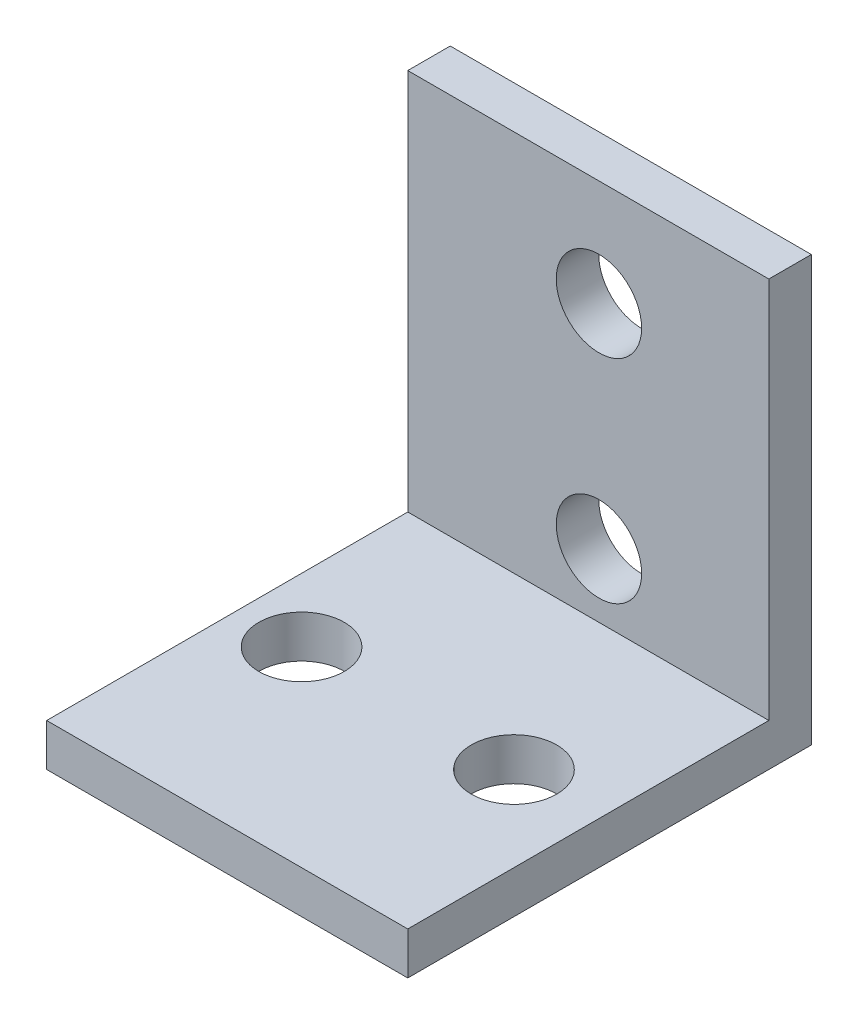
ISO-10303-21;
HEADER;
FILE_DESCRIPTION(('STEP AP214'),'2;1');
FILE_NAME('part.step','',(''),(''),'','','');
FILE_SCHEMA(('AUTOMOTIVE_DESIGN { 1 0 10303 214 1 1 1 1 }'));
ENDSEC;
DATA;
#1=APPLICATION_CONTEXT('core data for automotive mechanical design processes');
#2=APPLICATION_PROTOCOL_DEFINITION('international standard','automotive_design',2000,#1);
#3=PRODUCT_CONTEXT('',#1,'mechanical');
#4=PRODUCT('Part','Part','',(#3));
#5=PRODUCT_RELATED_PRODUCT_CATEGORY('part','',(#4));
#6=PRODUCT_DEFINITION_FORMATION('','',#4);
#7=PRODUCT_DEFINITION_CONTEXT('part definition',#1,'design');
#8=PRODUCT_DEFINITION('design','',#6,#7);
#9=PRODUCT_DEFINITION_SHAPE('','',#8);
#10=(LENGTH_UNIT() NAMED_UNIT(*) SI_UNIT(.MILLI.,.METRE.));
#11=(NAMED_UNIT(*) PLANE_ANGLE_UNIT() SI_UNIT($,.RADIAN.));
#12=(NAMED_UNIT(*) SI_UNIT($,.STERADIAN.) SOLID_ANGLE_UNIT());
#13=UNCERTAINTY_MEASURE_WITH_UNIT(LENGTH_MEASURE(1.E-05),#10,'distance_accuracy_value','');
#14=(GEOMETRIC_REPRESENTATION_CONTEXT(3) GLOBAL_UNCERTAINTY_ASSIGNED_CONTEXT((#13)) GLOBAL_UNIT_ASSIGNED_CONTEXT((#10,
#11,#12)) REPRESENTATION_CONTEXT('',''));
#15=CARTESIAN_POINT('',(0.,0.,0.));
#16=DIRECTION('',(0.,0.,1.));
#17=DIRECTION('',(1.,0.,0.));
#18=AXIS2_PLACEMENT_3D('',#15,#16,#17);
#19=CARTESIAN_POINT('',(0.,0.,24.13));
#20=DIRECTION('',(1.,0.,0.));
#21=DIRECTION('',(0.,0.,-1.));
#22=AXIS2_PLACEMENT_3D('',#19,#20,#21);
#23=PLANE('',#22);
#24=DIRECTION('',(0.,0.,-1.));
#25=VECTOR('',#24,1.);
#26=CARTESIAN_POINT('',(0.,2.54,2.54));
#27=LINE('',#26,#25);
#28=CARTESIAN_POINT('',(0.,2.54,24.13));
#29=VERTEX_POINT('',#28);
#30=CARTESIAN_POINT('',(0.,2.54,2.54));
#31=VERTEX_POINT('',#30);
#32=EDGE_CURVE('E54',#29,#31,#27,.T.);
#33=ORIENTED_EDGE('',*,*,#32,.T.);
#34=DIRECTION('',(0.,1.,0.));
#35=VECTOR('',#34,1.);
#36=CARTESIAN_POINT('',(0.,25.4,2.54));
#37=LINE('',#36,#35);
#38=CARTESIAN_POINT('',(0.,25.4,2.54));
#39=VERTEX_POINT('',#38);
#40=EDGE_CURVE('E90',#31,#39,#37,.T.);
#41=ORIENTED_EDGE('',*,*,#40,.T.);
#42=DIRECTION('',(0.,0.,-1.));
#43=VECTOR('',#42,1.);
#44=CARTESIAN_POINT('',(0.,25.4,24.13));
#45=LINE('',#44,#43);
#46=CARTESIAN_POINT('',(0.,25.4,0.));
#47=VERTEX_POINT('',#46);
#48=EDGE_CURVE('E83',#39,#47,#45,.T.);
#49=ORIENTED_EDGE('',*,*,#48,.T.);
#50=DIRECTION('',(0.,-1.,0.));
#51=VECTOR('',#50,1.);
#52=CARTESIAN_POINT('',(0.,0.,0.));
#53=LINE('',#52,#51);
#54=CARTESIAN_POINT('',(0.,0.,0.));
#55=VERTEX_POINT('',#54);
#56=EDGE_CURVE('E87',#47,#55,#53,.T.);
#57=ORIENTED_EDGE('',*,*,#56,.T.);
#58=DIRECTION('',(0.,0.,-1.));
#59=VECTOR('',#58,1.);
#60=CARTESIAN_POINT('',(0.,0.,24.13));
#61=LINE('',#60,#59);
#62=CARTESIAN_POINT('',(0.,0.,24.13));
#63=VERTEX_POINT('',#62);
#64=EDGE_CURVE('E11',#63,#55,#61,.T.);
#65=ORIENTED_EDGE('',*,*,#64,.F.);
#66=DIRECTION('',(0.,-1.,0.));
#67=VECTOR('',#66,1.);
#68=CARTESIAN_POINT('',(0.,0.,24.13));
#69=LINE('',#68,#67);
#70=EDGE_CURVE('E105',#29,#63,#69,.T.);
#71=ORIENTED_EDGE('',*,*,#70,.F.);
#72=EDGE_LOOP('',(#33,#41,#49,#57,#65,#71));
#73=FACE_BOUND('',#72,.T.);
#74=ADVANCED_FACE('F39',(#73),#23,.F.);
#75=CARTESIAN_POINT('',(0.,0.,24.13));
#76=DIRECTION('',(0.,1.,0.));
#77=DIRECTION('',(0.,0.,1.));
#78=AXIS2_PLACEMENT_3D('',#75,#76,#77);
#79=PLANE('',#78);
#80=CARTESIAN_POINT('',(16.51,0.,12.7));
#81=DIRECTION('',(0.,1.,0.));
#82=DIRECTION('',(0.,0.,1.));
#83=AXIS2_PLACEMENT_3D('',#80,#81,#82);
#84=CIRCLE('',#83,2.5527);
#85=CARTESIAN_POINT('',(16.51,0.,15.2527));
#86=VERTEX_POINT('',#85);
#87=EDGE_CURVE('E161',#86,#86,#84,.T.);
#88=ORIENTED_EDGE('',*,*,#87,.T.);
#89=EDGE_LOOP('',(#88));
#90=FACE_BOUND('',#89,.T.);
#91=CARTESIAN_POINT('',(3.81,0.,12.7));
#92=DIRECTION('',(0.,1.,0.));
#93=DIRECTION('',(0.,0.,1.));
#94=AXIS2_PLACEMENT_3D('',#91,#92,#93);
#95=CIRCLE('',#94,2.5527);
#96=CARTESIAN_POINT('',(3.81,0.,15.2527));
#97=VERTEX_POINT('',#96);
#98=EDGE_CURVE('E176',#97,#97,#95,.T.);
#99=ORIENTED_EDGE('',*,*,#98,.T.);
#100=EDGE_LOOP('',(#99));
#101=FACE_BOUND('',#100,.T.);
#102=DIRECTION('',(1.,0.,0.));
#103=VECTOR('',#102,1.);
#104=CARTESIAN_POINT('',(0.,0.,0.));
#105=LINE('',#104,#103);
#106=CARTESIAN_POINT('',(21.59,0.,0.));
#107=VERTEX_POINT('',#106);
#108=EDGE_CURVE('E109',#55,#107,#105,.T.);
#109=ORIENTED_EDGE('',*,*,#108,.T.);
#110=DIRECTION('',(0.,0.,-1.));
#111=VECTOR('',#110,1.);
#112=CARTESIAN_POINT('',(21.59,0.,24.13));
#113=LINE('',#112,#111);
#114=CARTESIAN_POINT('',(21.59,0.,24.13));
#115=VERTEX_POINT('',#114);
#116=EDGE_CURVE('E47',#115,#107,#113,.T.);
#117=ORIENTED_EDGE('',*,*,#116,.F.);
#118=DIRECTION('',(1.,0.,0.));
#119=VECTOR('',#118,1.);
#120=CARTESIAN_POINT('',(0.,0.,24.13));
#121=LINE('',#120,#119);
#122=EDGE_CURVE('E63',#63,#115,#121,.T.);
#123=ORIENTED_EDGE('',*,*,#122,.F.);
#124=ORIENTED_EDGE('',*,*,#64,.T.);
#125=EDGE_LOOP('',(#109,#117,#123,#124));
#126=FACE_BOUND('',#125,.T.);
#127=ADVANCED_FACE('F132',(#90,#101,#126),#79,.F.);
#128=CARTESIAN_POINT('',(21.59,0.,24.13));
#129=DIRECTION('',(-1.,0.,0.));
#130=DIRECTION('',(0.,0.,1.));
#131=AXIS2_PLACEMENT_3D('',#128,#129,#130);
#132=PLANE('',#131);
#133=DIRECTION('',(0.,0.,-1.));
#134=VECTOR('',#133,1.);
#135=CARTESIAN_POINT('',(21.59,25.4,24.13));
#136=LINE('',#135,#134);
#137=CARTESIAN_POINT('',(21.59,25.4,2.54));
#138=VERTEX_POINT('',#137);
#139=CARTESIAN_POINT('',(21.59,25.4,0.));
#140=VERTEX_POINT('',#139);
#141=EDGE_CURVE('E94',#138,#140,#136,.T.);
#142=ORIENTED_EDGE('',*,*,#141,.F.);
#143=DIRECTION('',(0.,1.,0.));
#144=VECTOR('',#143,1.);
#145=CARTESIAN_POINT('',(21.59,25.4,2.54));
#146=LINE('',#145,#144);
#147=CARTESIAN_POINT('',(21.59,2.54,2.54));
#148=VERTEX_POINT('',#147);
#149=EDGE_CURVE('E147',#148,#138,#146,.T.);
#150=ORIENTED_EDGE('',*,*,#149,.F.);
#151=DIRECTION('',(0.,0.,-1.));
#152=VECTOR('',#151,1.);
#153=CARTESIAN_POINT('',(21.59,2.54,2.54));
#154=LINE('',#153,#152);
#155=CARTESIAN_POINT('',(21.59,2.54,24.13));
#156=VERTEX_POINT('',#155);
#157=EDGE_CURVE('E143',#156,#148,#154,.T.);
#158=ORIENTED_EDGE('',*,*,#157,.F.);
#159=DIRECTION('',(0.,1.,0.));
#160=VECTOR('',#159,1.);
#161=CARTESIAN_POINT('',(21.59,0.,24.13));
#162=LINE('',#161,#160);
#163=EDGE_CURVE('E95',#115,#156,#162,.T.);
#164=ORIENTED_EDGE('',*,*,#163,.F.);
#165=ORIENTED_EDGE('',*,*,#116,.T.);
#166=DIRECTION('',(0.,1.,0.));
#167=VECTOR('',#166,1.);
#168=CARTESIAN_POINT('',(21.59,0.,0.));
#169=LINE('',#168,#167);
#170=EDGE_CURVE('E106',#107,#140,#169,.T.);
#171=ORIENTED_EDGE('',*,*,#170,.T.);
#172=EDGE_LOOP('',(#142,#150,#158,#164,#165,#171));
#173=FACE_BOUND('',#172,.T.);
#174=ADVANCED_FACE('F129',(#173),#132,.F.);
#175=CARTESIAN_POINT('',(0.,25.4,24.13));
#176=DIRECTION('',(0.,-1.,0.));
#177=DIRECTION('',(0.,0.,-1.));
#178=AXIS2_PLACEMENT_3D('',#175,#176,#177);
#179=PLANE('',#178);
#180=ORIENTED_EDGE('',*,*,#48,.F.);
#181=DIRECTION('',(1.,0.,0.));
#182=VECTOR('',#181,1.);
#183=CARTESIAN_POINT('',(0.,25.4,2.54));
#184=LINE('',#183,#182);
#185=EDGE_CURVE('E138',#39,#138,#184,.T.);
#186=ORIENTED_EDGE('',*,*,#185,.T.);
#187=ORIENTED_EDGE('',*,*,#141,.T.);
#188=DIRECTION('',(-1.,0.,0.));
#189=VECTOR('',#188,1.);
#190=CARTESIAN_POINT('',(0.,25.4,0.));
#191=LINE('',#190,#189);
#192=EDGE_CURVE('E98',#140,#47,#191,.T.);
#193=ORIENTED_EDGE('',*,*,#192,.T.);
#194=EDGE_LOOP('',(#180,#186,#187,#193));
#195=FACE_BOUND('',#194,.T.);
#196=ADVANCED_FACE('F99',(#195),#179,.F.);
#197=CARTESIAN_POINT('',(0.,0.,24.13));
#198=DIRECTION('',(0.,0.,-1.));
#199=DIRECTION('',(-1.,0.,0.));
#200=AXIS2_PLACEMENT_3D('',#197,#198,#199);
#201=PLANE('',#200);
#202=ORIENTED_EDGE('',*,*,#163,.T.);
#203=DIRECTION('',(1.,0.,0.));
#204=VECTOR('',#203,1.);
#205=CARTESIAN_POINT('',(0.,2.54,24.13));
#206=LINE('',#205,#204);
#207=EDGE_CURVE('E117',#29,#156,#206,.T.);
#208=ORIENTED_EDGE('',*,*,#207,.F.);
#209=ORIENTED_EDGE('',*,*,#70,.T.);
#210=ORIENTED_EDGE('',*,*,#122,.T.);
#211=EDGE_LOOP('',(#202,#208,#209,#210));
#212=FACE_BOUND('',#211,.T.);
#213=ADVANCED_FACE('F220',(#212),#201,.F.);
#214=CARTESIAN_POINT('',(0.,0.,0.));
#215=DIRECTION('',(0.,0.,-1.));
#216=DIRECTION('',(-1.,0.,0.));
#217=AXIS2_PLACEMENT_3D('',#214,#215,#216);
#218=PLANE('',#217);
#219=CARTESIAN_POINT('',(11.43,19.05,0.));
#220=DIRECTION('',(0.,0.,1.));
#221=DIRECTION('',(1.,0.,0.));
#222=AXIS2_PLACEMENT_3D('',#219,#220,#221);
#223=CIRCLE('',#222,2.5527);
#224=CARTESIAN_POINT('',(13.9827,19.05,0.));
#225=VERTEX_POINT('',#224);
#226=EDGE_CURVE('E151',#225,#225,#223,.T.);
#227=ORIENTED_EDGE('',*,*,#226,.T.);
#228=EDGE_LOOP('',(#227));
#229=FACE_BOUND('',#228,.T.);
#230=CARTESIAN_POINT('',(11.43,6.35,0.));
#231=DIRECTION('',(0.,0.,1.));
#232=DIRECTION('',(1.,0.,0.));
#233=AXIS2_PLACEMENT_3D('',#230,#231,#232);
#234=CIRCLE('',#233,2.5527);
#235=CARTESIAN_POINT('',(13.9827,6.35,0.));
#236=VERTEX_POINT('',#235);
#237=EDGE_CURVE('E160',#236,#236,#234,.T.);
#238=ORIENTED_EDGE('',*,*,#237,.T.);
#239=EDGE_LOOP('',(#238));
#240=FACE_BOUND('',#239,.T.);
#241=ORIENTED_EDGE('',*,*,#56,.F.);
#242=ORIENTED_EDGE('',*,*,#192,.F.);
#243=ORIENTED_EDGE('',*,*,#170,.F.);
#244=ORIENTED_EDGE('',*,*,#108,.F.);
#245=EDGE_LOOP('',(#241,#242,#243,#244));
#246=FACE_BOUND('',#245,.T.);
#247=ADVANCED_FACE('F108',(#229,#240,#246),#218,.T.);
#248=CARTESIAN_POINT('',(0.,25.4,2.54));
#249=DIRECTION('',(0.,0.,-1.));
#250=DIRECTION('',(0.,1.,0.));
#251=AXIS2_PLACEMENT_3D('',#248,#249,#250);
#252=PLANE('',#251);
#253=CARTESIAN_POINT('',(11.43,19.05,2.54));
#254=DIRECTION('',(0.,0.,1.));
#255=DIRECTION('',(1.,0.,0.));
#256=AXIS2_PLACEMENT_3D('',#253,#254,#255);
#257=CIRCLE('',#256,2.5527);
#258=CARTESIAN_POINT('',(13.9827,19.05,2.54));
#259=VERTEX_POINT('',#258);
#260=EDGE_CURVE('E165',#259,#259,#257,.T.);
#261=ORIENTED_EDGE('',*,*,#260,.F.);
#262=EDGE_LOOP('',(#261));
#263=FACE_BOUND('',#262,.T.);
#264=CARTESIAN_POINT('',(11.43,6.35,2.54));
#265=DIRECTION('',(0.,0.,1.));
#266=DIRECTION('',(1.,0.,0.));
#267=AXIS2_PLACEMENT_3D('',#264,#265,#266);
#268=CIRCLE('',#267,2.5527);
#269=CARTESIAN_POINT('',(13.9827,6.35,2.54));
#270=VERTEX_POINT('',#269);
#271=EDGE_CURVE('E156',#270,#270,#268,.T.);
#272=ORIENTED_EDGE('',*,*,#271,.F.);
#273=EDGE_LOOP('',(#272));
#274=FACE_BOUND('',#273,.T.);
#275=ORIENTED_EDGE('',*,*,#149,.T.);
#276=ORIENTED_EDGE('',*,*,#185,.F.);
#277=ORIENTED_EDGE('',*,*,#40,.F.);
#278=DIRECTION('',(1.,0.,0.));
#279=VECTOR('',#278,1.);
#280=CARTESIAN_POINT('',(0.,2.54,2.54));
#281=LINE('',#280,#279);
#282=EDGE_CURVE('E111',#31,#148,#281,.T.);
#283=ORIENTED_EDGE('',*,*,#282,.T.);
#284=EDGE_LOOP('',(#275,#276,#277,#283));
#285=FACE_BOUND('',#284,.T.);
#286=ADVANCED_FACE('F201',(#263,#274,#285),#252,.F.);
#287=CARTESIAN_POINT('',(0.,2.54,2.54));
#288=DIRECTION('',(0.,-1.,0.));
#289=DIRECTION('',(0.,0.,-1.));
#290=AXIS2_PLACEMENT_3D('',#287,#288,#289);
#291=PLANE('',#290);
#292=CARTESIAN_POINT('',(16.51,2.54,12.7));
#293=DIRECTION('',(0.,1.,0.));
#294=DIRECTION('',(0.,0.,1.));
#295=AXIS2_PLACEMENT_3D('',#292,#293,#294);
#296=CIRCLE('',#295,2.5527);
#297=CARTESIAN_POINT('',(16.51,2.54,15.2527));
#298=VERTEX_POINT('',#297);
#299=EDGE_CURVE('E180',#298,#298,#296,.T.);
#300=ORIENTED_EDGE('',*,*,#299,.F.);
#301=EDGE_LOOP('',(#300));
#302=FACE_BOUND('',#301,.T.);
#303=CARTESIAN_POINT('',(3.81,2.54,12.7));
#304=DIRECTION('',(0.,1.,0.));
#305=DIRECTION('',(0.,0.,1.));
#306=AXIS2_PLACEMENT_3D('',#303,#304,#305);
#307=CIRCLE('',#306,2.5527);
#308=CARTESIAN_POINT('',(3.81,2.54,15.2527));
#309=VERTEX_POINT('',#308);
#310=EDGE_CURVE('E172',#309,#309,#307,.T.);
#311=ORIENTED_EDGE('',*,*,#310,.F.);
#312=EDGE_LOOP('',(#311));
#313=FACE_BOUND('',#312,.T.);
#314=ORIENTED_EDGE('',*,*,#157,.T.);
#315=ORIENTED_EDGE('',*,*,#282,.F.);
#316=ORIENTED_EDGE('',*,*,#32,.F.);
#317=ORIENTED_EDGE('',*,*,#207,.T.);
#318=EDGE_LOOP('',(#314,#315,#316,#317));
#319=FACE_BOUND('',#318,.T.);
#320=ADVANCED_FACE('F197',(#302,#313,#319),#291,.F.);
#321=CARTESIAN_POINT('',(11.43,6.35,0.));
#322=DIRECTION('',(0.,0.,1.));
#323=DIRECTION('',(1.,0.,0.));
#324=AXIS2_PLACEMENT_3D('',#321,#322,#323);
#325=CYLINDRICAL_SURFACE('',#324,2.5527);
#326=CARTESIAN_POINT('',(13.9827,6.35,0.));
#327=CARTESIAN_POINT('',(13.9827,6.35,0.0264583333333333));
#328=CARTESIAN_POINT('',(13.9827,6.35,0.0529166666666666));
#329=CARTESIAN_POINT('',(13.9827,6.35,0.105833333333333));
#330=CARTESIAN_POINT('',(13.9827,6.35,0.132291666666667));
#331=CARTESIAN_POINT('',(13.9827,6.35,0.185208333333333));
#332=CARTESIAN_POINT('',(13.9827,6.35,0.211666666666666));
#333=CARTESIAN_POINT('',(13.9827,6.35,0.264583333333333));
#334=CARTESIAN_POINT('',(13.9827,6.35,0.291041666666666));
#335=CARTESIAN_POINT('',(13.9827,6.35,0.343958333333333));
#336=CARTESIAN_POINT('',(13.9827,6.35,0.370416666666666));
#337=CARTESIAN_POINT('',(13.9827,6.35,0.423333333333333));
#338=CARTESIAN_POINT('',(13.9827,6.35,0.449791666666666));
#339=CARTESIAN_POINT('',(13.9827,6.35,0.502708333333333));
#340=CARTESIAN_POINT('',(13.9827,6.35,0.529166666666666));
#341=CARTESIAN_POINT('',(13.9827,6.35,0.582083333333333));
#342=CARTESIAN_POINT('',(13.9827,6.35,0.608541666666666));
#343=CARTESIAN_POINT('',(13.9827,6.35,0.661458333333333));
#344=CARTESIAN_POINT('',(13.9827,6.35,0.687916666666666));
#345=CARTESIAN_POINT('',(13.9827,6.35,0.740833333333333));
#346=CARTESIAN_POINT('',(13.9827,6.35,0.767291666666666));
#347=CARTESIAN_POINT('',(13.9827,6.35,0.820208333333333));
#348=CARTESIAN_POINT('',(13.9827,6.35,0.846666666666666));
#349=CARTESIAN_POINT('',(13.9827,6.35,0.899583333333333));
#350=CARTESIAN_POINT('',(13.9827,6.35,0.926041666666666));
#351=CARTESIAN_POINT('',(13.9827,6.35,0.978958333333332));
#352=CARTESIAN_POINT('',(13.9827,6.35,1.00541666666667));
#353=CARTESIAN_POINT('',(13.9827,6.35,1.05833333333333));
#354=CARTESIAN_POINT('',(13.9827,6.35,1.08479166666667));
#355=CARTESIAN_POINT('',(13.9827,6.35,1.13770833333333));
#356=CARTESIAN_POINT('',(13.9827,6.35,1.16416666666667));
#357=CARTESIAN_POINT('',(13.9827,6.35,1.21708333333333));
#358=CARTESIAN_POINT('',(13.9827,6.35,1.24354166666667));
#359=CARTESIAN_POINT('',(13.9827,6.35,1.29645833333333));
#360=CARTESIAN_POINT('',(13.9827,6.35,1.32291666666667));
#361=CARTESIAN_POINT('',(13.9827,6.35,1.37583333333333));
#362=CARTESIAN_POINT('',(13.9827,6.35,1.40229166666667));
#363=CARTESIAN_POINT('',(13.9827,6.35,1.45520833333333));
#364=CARTESIAN_POINT('',(13.9827,6.35,1.48166666666667));
#365=CARTESIAN_POINT('',(13.9827,6.35,1.53458333333333));
#366=CARTESIAN_POINT('',(13.9827,6.35,1.56104166666667));
#367=CARTESIAN_POINT('',(13.9827,6.35,1.61395833333333));
#368=CARTESIAN_POINT('',(13.9827,6.35,1.64041666666667));
#369=CARTESIAN_POINT('',(13.9827,6.35,1.69333333333333));
#370=CARTESIAN_POINT('',(13.9827,6.35,1.71979166666667));
#371=CARTESIAN_POINT('',(13.9827,6.35,1.77270833333333));
#372=CARTESIAN_POINT('',(13.9827,6.35,1.79916666666667));
#373=CARTESIAN_POINT('',(13.9827,6.35,1.85208333333333));
#374=CARTESIAN_POINT('',(13.9827,6.35,1.87854166666666));
#375=CARTESIAN_POINT('',(13.9827,6.35,1.93145833333333));
#376=CARTESIAN_POINT('',(13.9827,6.35,1.95791666666666));
#377=CARTESIAN_POINT('',(13.9827,6.35,2.01083333333333));
#378=CARTESIAN_POINT('',(13.9827,6.35,2.03729166666666));
#379=CARTESIAN_POINT('',(13.9827,6.35,2.09020833333333));
#380=CARTESIAN_POINT('',(13.9827,6.35,2.11666666666666));
#381=CARTESIAN_POINT('',(13.9827,6.35,2.16958333333333));
#382=CARTESIAN_POINT('',(13.9827,6.35,2.19604166666666));
#383=CARTESIAN_POINT('',(13.9827,6.35,2.24895833333333));
#384=CARTESIAN_POINT('',(13.9827,6.35,2.27541666666666));
#385=CARTESIAN_POINT('',(13.9827,6.35,2.32833333333333));
#386=CARTESIAN_POINT('',(13.9827,6.35,2.35479166666666));
#387=CARTESIAN_POINT('',(13.9827,6.35,2.40770833333333));
#388=CARTESIAN_POINT('',(13.9827,6.35,2.43416666666666));
#389=CARTESIAN_POINT('',(13.9827,6.35,2.48708333333333));
#390=CARTESIAN_POINT('',(13.9827,6.35,2.51354166666666));
#391=CARTESIAN_POINT('',(13.9827,6.35,2.54));
#392=B_SPLINE_CURVE_WITH_KNOTS('',3,(#326,#327,#328,#329,#330,#331,#332,#333,#334,#335,#336,
#337,#338,#339,#340,#341,#342,#343,#344,#345,#346,#347,#348,#349,#350,#351,#352,#353,#354,#355,
#356,#357,#358,#359,#360,#361,#362,#363,#364,#365,#366,#367,#368,#369,#370,#371,#372,#373,#374,
#375,#376,#377,#378,#379,#380,#381,#382,#383,#384,#385,#386,#387,#388,#389,#390,#391),
.UNSPECIFIED.,.F.,.F.,(4,2,2,2,2,2,2,2,2,2,2,2,2,2,2,2,2,2,2,2,2,2,2,2,2,2,2,2,2,2,2,2,4),(0.,
0.0793749999999999,0.15875,0.238125,0.3175,0.396875,0.47625,0.555624999999999,0.634999999999999,
0.714374999999999,0.793749999999999,0.873124999999999,0.952499999999999,1.031875,1.11125,
1.190625,1.27,1.349375,1.42875,1.508125,1.5875,1.666875,1.74625,1.825625,1.905,1.984375,2.06375,
2.143125,2.2225,2.301875,2.38125,2.460625,2.54),.UNSPECIFIED.);
#393=EDGE_CURVE('BSEAM200',#236,#270,#392,.T.);
#394=ORIENTED_EDGE('',*,*,#237,.F.);
#395=ORIENTED_EDGE('',*,*,#271,.T.);
#396=ORIENTED_EDGE('',*,*,#393,.T.);
#397=ORIENTED_EDGE('',*,*,#393,.F.);
#398=EDGE_LOOP('',(#394,#396,#395,#397));
#399=FACE_BOUND('',#398,.T.);
#400=ADVANCED_FACE('F200',(#399),#325,.F.);
#401=CARTESIAN_POINT('',(11.43,19.05,0.));
#402=DIRECTION('',(0.,0.,1.));
#403=DIRECTION('',(1.,0.,0.));
#404=AXIS2_PLACEMENT_3D('',#401,#402,#403);
#405=CYLINDRICAL_SURFACE('',#404,2.5527);
#406=CARTESIAN_POINT('',(13.9827,19.05,0.));
#407=CARTESIAN_POINT('',(13.9827,19.05,0.0264583333333333));
#408=CARTESIAN_POINT('',(13.9827,19.05,0.0529166666666666));
#409=CARTESIAN_POINT('',(13.9827,19.05,0.105833333333333));
#410=CARTESIAN_POINT('',(13.9827,19.05,0.132291666666667));
#411=CARTESIAN_POINT('',(13.9827,19.05,0.185208333333333));
#412=CARTESIAN_POINT('',(13.9827,19.05,0.211666666666666));
#413=CARTESIAN_POINT('',(13.9827,19.05,0.264583333333333));
#414=CARTESIAN_POINT('',(13.9827,19.05,0.291041666666666));
#415=CARTESIAN_POINT('',(13.9827,19.05,0.343958333333333));
#416=CARTESIAN_POINT('',(13.9827,19.05,0.370416666666666));
#417=CARTESIAN_POINT('',(13.9827,19.05,0.423333333333333));
#418=CARTESIAN_POINT('',(13.9827,19.05,0.449791666666666));
#419=CARTESIAN_POINT('',(13.9827,19.05,0.502708333333333));
#420=CARTESIAN_POINT('',(13.9827,19.05,0.529166666666666));
#421=CARTESIAN_POINT('',(13.9827,19.05,0.582083333333333));
#422=CARTESIAN_POINT('',(13.9827,19.05,0.608541666666666));
#423=CARTESIAN_POINT('',(13.9827,19.05,0.661458333333333));
#424=CARTESIAN_POINT('',(13.9827,19.05,0.687916666666666));
#425=CARTESIAN_POINT('',(13.9827,19.05,0.740833333333333));
#426=CARTESIAN_POINT('',(13.9827,19.05,0.767291666666666));
#427=CARTESIAN_POINT('',(13.9827,19.05,0.820208333333333));
#428=CARTESIAN_POINT('',(13.9827,19.05,0.846666666666666));
#429=CARTESIAN_POINT('',(13.9827,19.05,0.899583333333333));
#430=CARTESIAN_POINT('',(13.9827,19.05,0.926041666666666));
#431=CARTESIAN_POINT('',(13.9827,19.05,0.978958333333332));
#432=CARTESIAN_POINT('',(13.9827,19.05,1.00541666666667));
#433=CARTESIAN_POINT('',(13.9827,19.05,1.05833333333333));
#434=CARTESIAN_POINT('',(13.9827,19.05,1.08479166666667));
#435=CARTESIAN_POINT('',(13.9827,19.05,1.13770833333333));
#436=CARTESIAN_POINT('',(13.9827,19.05,1.16416666666667));
#437=CARTESIAN_POINT('',(13.9827,19.05,1.21708333333333));
#438=CARTESIAN_POINT('',(13.9827,19.05,1.24354166666667));
#439=CARTESIAN_POINT('',(13.9827,19.05,1.29645833333333));
#440=CARTESIAN_POINT('',(13.9827,19.05,1.32291666666667));
#441=CARTESIAN_POINT('',(13.9827,19.05,1.37583333333333));
#442=CARTESIAN_POINT('',(13.9827,19.05,1.40229166666667));
#443=CARTESIAN_POINT('',(13.9827,19.05,1.45520833333333));
#444=CARTESIAN_POINT('',(13.9827,19.05,1.48166666666667));
#445=CARTESIAN_POINT('',(13.9827,19.05,1.53458333333333));
#446=CARTESIAN_POINT('',(13.9827,19.05,1.56104166666667));
#447=CARTESIAN_POINT('',(13.9827,19.05,1.61395833333333));
#448=CARTESIAN_POINT('',(13.9827,19.05,1.64041666666667));
#449=CARTESIAN_POINT('',(13.9827,19.05,1.69333333333333));
#450=CARTESIAN_POINT('',(13.9827,19.05,1.71979166666667));
#451=CARTESIAN_POINT('',(13.9827,19.05,1.77270833333333));
#452=CARTESIAN_POINT('',(13.9827,19.05,1.79916666666667));
#453=CARTESIAN_POINT('',(13.9827,19.05,1.85208333333333));
#454=CARTESIAN_POINT('',(13.9827,19.05,1.87854166666666));
#455=CARTESIAN_POINT('',(13.9827,19.05,1.93145833333333));
#456=CARTESIAN_POINT('',(13.9827,19.05,1.95791666666666));
#457=CARTESIAN_POINT('',(13.9827,19.05,2.01083333333333));
#458=CARTESIAN_POINT('',(13.9827,19.05,2.03729166666666));
#459=CARTESIAN_POINT('',(13.9827,19.05,2.09020833333333));
#460=CARTESIAN_POINT('',(13.9827,19.05,2.11666666666666));
#461=CARTESIAN_POINT('',(13.9827,19.05,2.16958333333333));
#462=CARTESIAN_POINT('',(13.9827,19.05,2.19604166666666));
#463=CARTESIAN_POINT('',(13.9827,19.05,2.24895833333333));
#464=CARTESIAN_POINT('',(13.9827,19.05,2.27541666666666));
#465=CARTESIAN_POINT('',(13.9827,19.05,2.32833333333333));
#466=CARTESIAN_POINT('',(13.9827,19.05,2.35479166666666));
#467=CARTESIAN_POINT('',(13.9827,19.05,2.40770833333333));
#468=CARTESIAN_POINT('',(13.9827,19.05,2.43416666666666));
#469=CARTESIAN_POINT('',(13.9827,19.05,2.48708333333333));
#470=CARTESIAN_POINT('',(13.9827,19.05,2.51354166666666));
#471=CARTESIAN_POINT('',(13.9827,19.05,2.54));
#472=B_SPLINE_CURVE_WITH_KNOTS('',3,(#406,#407,#408,#409,#410,#411,#412,#413,#414,#415,#416,
#417,#418,#419,#420,#421,#422,#423,#424,#425,#426,#427,#428,#429,#430,#431,#432,#433,#434,#435,
#436,#437,#438,#439,#440,#441,#442,#443,#444,#445,#446,#447,#448,#449,#450,#451,#452,#453,#454,
#455,#456,#457,#458,#459,#460,#461,#462,#463,#464,#465,#466,#467,#468,#469,#470,#471),
.UNSPECIFIED.,.F.,.F.,(4,2,2,2,2,2,2,2,2,2,2,2,2,2,2,2,2,2,2,2,2,2,2,2,2,2,2,2,2,2,2,2,4),(0.,
0.0793749999999999,0.15875,0.238125,0.3175,0.396875,0.47625,0.555624999999999,0.634999999999999,
0.714374999999999,0.793749999999999,0.873124999999999,0.952499999999999,1.031875,1.11125,
1.190625,1.27,1.349375,1.42875,1.508125,1.5875,1.666875,1.74625,1.825625,1.905,1.984375,2.06375,
2.143125,2.2225,2.301875,2.38125,2.460625,2.54),.UNSPECIFIED.);
#473=EDGE_CURVE('BSEAM260',#225,#259,#472,.T.);
#474=ORIENTED_EDGE('',*,*,#226,.F.);
#475=ORIENTED_EDGE('',*,*,#260,.T.);
#476=ORIENTED_EDGE('',*,*,#473,.T.);
#477=ORIENTED_EDGE('',*,*,#473,.F.);
#478=EDGE_LOOP('',(#474,#476,#475,#477));
#479=FACE_BOUND('',#478,.T.);
#480=ADVANCED_FACE('F260',(#479),#405,.F.);
#481=CARTESIAN_POINT('',(3.81,0.,12.7));
#482=DIRECTION('',(0.,1.,0.));
#483=DIRECTION('',(0.,0.,1.));
#484=AXIS2_PLACEMENT_3D('',#481,#482,#483);
#485=CYLINDRICAL_SURFACE('',#484,2.5527);
#486=ORIENTED_EDGE('',*,*,#98,.F.);
#487=EDGE_LOOP('',(#486));
#488=FACE_BOUND('',#487,.T.);
#489=ORIENTED_EDGE('',*,*,#310,.T.);
#490=EDGE_LOOP('',(#489));
#491=FACE_BOUND('',#490,.T.);
#492=ADVANCED_FACE('F193',(#488,#491),#485,.F.);
#493=CARTESIAN_POINT('',(16.51,0.,12.7));
#494=DIRECTION('',(0.,1.,0.));
#495=DIRECTION('',(0.,0.,1.));
#496=AXIS2_PLACEMENT_3D('',#493,#494,#495);
#497=CYLINDRICAL_SURFACE('',#496,2.5527);
#498=ORIENTED_EDGE('',*,*,#87,.F.);
#499=EDGE_LOOP('',(#498));
#500=FACE_BOUND('',#499,.T.);
#501=ORIENTED_EDGE('',*,*,#299,.T.);
#502=EDGE_LOOP('',(#501));
#503=FACE_BOUND('',#502,.T.);
#504=ADVANCED_FACE('F190',(#500,#503),#497,.F.);
#505=CLOSED_SHELL('',(#74,#127,#174,#196,#213,#247,#286,#320,#400,#480,#492,#504));
#506=MANIFOLD_SOLID_BREP('B2',#505);
#507=ADVANCED_BREP_SHAPE_REPRESENTATION('',(#18,#506),#14);
#508=SHAPE_DEFINITION_REPRESENTATION(#9,#507);
ENDSEC;
END-ISO-10303-21;
